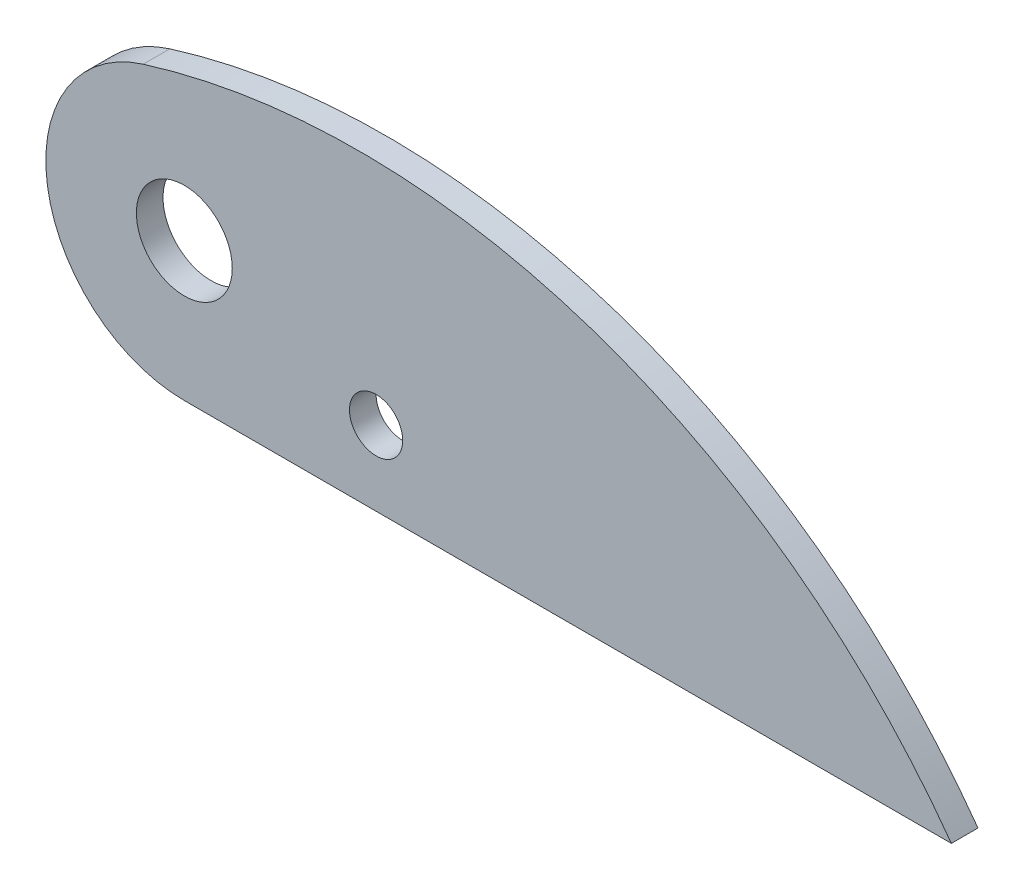
ISO-10303-21;
HEADER;
FILE_DESCRIPTION(('STEP AP214'),'2;1');
FILE_NAME('part.step','',(''),(''),'','','');
FILE_SCHEMA(('AUTOMOTIVE_DESIGN { 1 0 10303 214 1 1 1 1 }'));
ENDSEC;
DATA;
#1=APPLICATION_CONTEXT('core data for automotive mechanical design processes');
#2=APPLICATION_PROTOCOL_DEFINITION('international standard','automotive_design',2000,#1);
#3=PRODUCT_CONTEXT('',#1,'mechanical');
#4=PRODUCT('Part','Part','',(#3));
#5=PRODUCT_RELATED_PRODUCT_CATEGORY('part','',(#4));
#6=PRODUCT_DEFINITION_FORMATION('','',#4);
#7=PRODUCT_DEFINITION_CONTEXT('part definition',#1,'design');
#8=PRODUCT_DEFINITION('design','',#6,#7);
#9=PRODUCT_DEFINITION_SHAPE('','',#8);
#10=(LENGTH_UNIT() NAMED_UNIT(*) SI_UNIT(.MILLI.,.METRE.));
#11=(NAMED_UNIT(*) PLANE_ANGLE_UNIT() SI_UNIT($,.RADIAN.));
#12=(NAMED_UNIT(*) SI_UNIT($,.STERADIAN.) SOLID_ANGLE_UNIT());
#13=UNCERTAINTY_MEASURE_WITH_UNIT(LENGTH_MEASURE(1.E-05),#10,'distance_accuracy_value','');
#14=(GEOMETRIC_REPRESENTATION_CONTEXT(3) GLOBAL_UNCERTAINTY_ASSIGNED_CONTEXT((#13)) GLOBAL_UNIT_ASSIGNED_CONTEXT((#10,
#11,#12)) REPRESENTATION_CONTEXT('',''));
#15=CARTESIAN_POINT('',(0.,0.,0.));
#16=DIRECTION('',(0.,0.,1.));
#17=DIRECTION('',(1.,0.,0.));
#18=AXIS2_PLACEMENT_3D('',#15,#16,#17);
#19=CARTESIAN_POINT('',(0.,0.,2.5));
#20=DIRECTION('',(0.,0.,-1.));
#21=DIRECTION('',(-1.,0.,0.));
#22=AXIS2_PLACEMENT_3D('',#19,#20,#21);
#23=PLANE('',#22);
#24=CARTESIAN_POINT('',(0.,0.,2.5));
#25=DIRECTION('',(0.,0.,1.));
#26=DIRECTION('',(-1.,0.,0.));
#27=AXIS2_PLACEMENT_3D('',#24,#25,#26);
#28=CIRCLE('',#27,13.);
#29=CARTESIAN_POINT('',(-3.8556101254067,12.4150823823631,2.5));
#30=VERTEX_POINT('',#29);
#31=CARTESIAN_POINT('',(0.,-13.,2.5));
#32=VERTEX_POINT('',#31);
#33=EDGE_CURVE('E80',#30,#32,#28,.T.);
#34=ORIENTED_EDGE('',*,*,#33,.T.);
#35=DIRECTION('',(1.,0.,0.));
#36=VECTOR('',#35,1.);
#37=CARTESIAN_POINT('',(0.,-13.,2.5));
#38=LINE('',#37,#36);
#39=CARTESIAN_POINT('',(72.,-13.,2.5));
#40=VERTEX_POINT('',#39);
#41=EDGE_CURVE('E76',#32,#40,#38,.T.);
#42=ORIENTED_EDGE('',*,*,#41,.T.);
#43=CARTESIAN_POINT('',(16.4370747451547,-52.9274564721794,2.5));
#44=DIRECTION('',(0.,0.,1.));
#45=DIRECTION('',(-1.,0.,0.));
#46=AXIS2_PLACEMENT_3D('',#43,#44,#45);
#47=CIRCLE('',#46,68.421052631579);
#48=EDGE_CURVE('E56',#40,#30,#47,.T.);
#49=ORIENTED_EDGE('',*,*,#48,.T.);
#50=EDGE_LOOP('',(#34,#42,#49));
#51=FACE_BOUND('',#50,.T.);
#52=CARTESIAN_POINT('',(0.,0.,2.5));
#53=DIRECTION('',(0.,0.,1.));
#54=DIRECTION('',(1.,0.,0.));
#55=AXIS2_PLACEMENT_3D('',#52,#53,#54);
#56=CIRCLE('',#55,4.50000000000025);
#57=CARTESIAN_POINT('',(4.50000000000025,0.,2.5));
#58=VERTEX_POINT('',#57);
#59=EDGE_CURVE('E90',#58,#58,#56,.T.);
#60=ORIENTED_EDGE('',*,*,#59,.F.);
#61=EDGE_LOOP('',(#60));
#62=FACE_BOUND('',#61,.T.);
#63=CARTESIAN_POINT('',(18.,-6.,2.5));
#64=DIRECTION('',(0.,0.,1.));
#65=DIRECTION('',(1.,0.,0.));
#66=AXIS2_PLACEMENT_3D('',#63,#64,#65);
#67=CIRCLE('',#66,2.50000000000012);
#68=CARTESIAN_POINT('',(20.5000000000001,-6.,2.5));
#69=VERTEX_POINT('',#68);
#70=EDGE_CURVE('E109',#69,#69,#67,.T.);
#71=ORIENTED_EDGE('',*,*,#70,.F.);
#72=EDGE_LOOP('',(#71));
#73=FACE_BOUND('',#72,.T.);
#74=ADVANCED_FACE('F39',(#51,#62,#73),#23,.F.);
#75=CARTESIAN_POINT('',(0.,0.,0.));
#76=DIRECTION('',(0.,0.,-1.));
#77=DIRECTION('',(-1.,0.,0.));
#78=AXIS2_PLACEMENT_3D('',#75,#76,#77);
#79=PLANE('',#78);
#80=CARTESIAN_POINT('',(0.,0.,0.));
#81=DIRECTION('',(0.,0.,1.));
#82=DIRECTION('',(1.,0.,0.));
#83=AXIS2_PLACEMENT_3D('',#80,#81,#82);
#84=CIRCLE('',#83,4.50000000000025);
#85=CARTESIAN_POINT('',(4.50000000000025,0.,0.));
#86=VERTEX_POINT('',#85);
#87=EDGE_CURVE('E94',#86,#86,#84,.T.);
#88=ORIENTED_EDGE('',*,*,#87,.T.);
#89=EDGE_LOOP('',(#88));
#90=FACE_BOUND('',#89,.T.);
#91=CARTESIAN_POINT('',(0.,0.,0.));
#92=DIRECTION('',(0.,0.,1.));
#93=DIRECTION('',(-1.,0.,0.));
#94=AXIS2_PLACEMENT_3D('',#91,#92,#93);
#95=CIRCLE('',#94,13.);
#96=CARTESIAN_POINT('',(-3.8556101254067,12.4150823823631,0.));
#97=VERTEX_POINT('',#96);
#98=CARTESIAN_POINT('',(0.,-13.,0.));
#99=VERTEX_POINT('',#98);
#100=EDGE_CURVE('E87',#97,#99,#95,.T.);
#101=ORIENTED_EDGE('',*,*,#100,.F.);
#102=CARTESIAN_POINT('',(16.4370747451547,-52.9274564721794,0.));
#103=DIRECTION('',(0.,0.,1.));
#104=DIRECTION('',(-1.,0.,0.));
#105=AXIS2_PLACEMENT_3D('',#102,#103,#104);
#106=CIRCLE('',#105,68.421052631579);
#107=CARTESIAN_POINT('',(72.,-13.,0.));
#108=VERTEX_POINT('',#107);
#109=EDGE_CURVE('E73',#108,#97,#106,.T.);
#110=ORIENTED_EDGE('',*,*,#109,.F.);
#111=DIRECTION('',(1.,0.,0.));
#112=VECTOR('',#111,1.);
#113=CARTESIAN_POINT('',(0.,-13.,0.));
#114=LINE('',#113,#112);
#115=EDGE_CURVE('E68',#99,#108,#114,.T.);
#116=ORIENTED_EDGE('',*,*,#115,.F.);
#117=EDGE_LOOP('',(#101,#110,#116));
#118=FACE_BOUND('',#117,.T.);
#119=CARTESIAN_POINT('',(18.,-6.,0.));
#120=DIRECTION('',(0.,0.,1.));
#121=DIRECTION('',(1.,0.,0.));
#122=AXIS2_PLACEMENT_3D('',#119,#120,#121);
#123=CIRCLE('',#122,2.50000000000012);
#124=CARTESIAN_POINT('',(20.5000000000001,-6.,0.));
#125=VERTEX_POINT('',#124);
#126=EDGE_CURVE('E107',#125,#125,#123,.T.);
#127=ORIENTED_EDGE('',*,*,#126,.T.);
#128=EDGE_LOOP('',(#127));
#129=FACE_BOUND('',#128,.T.);
#130=ADVANCED_FACE('F100',(#90,#118,#129),#79,.T.);
#131=CARTESIAN_POINT('',(0.,0.,2.5));
#132=DIRECTION('',(0.,0.,-1.));
#133=DIRECTION('',(-1.,0.,0.));
#134=AXIS2_PLACEMENT_3D('',#131,#132,#133);
#135=CYLINDRICAL_SURFACE('',#134,13.);
#136=ORIENTED_EDGE('',*,*,#100,.T.);
#137=DIRECTION('',(0.,0.,-1.));
#138=VECTOR('',#137,1.);
#139=CARTESIAN_POINT('',(0.,-13.,2.5));
#140=LINE('',#139,#138);
#141=EDGE_CURVE('E11',#32,#99,#140,.T.);
#142=ORIENTED_EDGE('',*,*,#141,.F.);
#143=ORIENTED_EDGE('',*,*,#33,.F.);
#144=DIRECTION('',(0.,0.,-1.));
#145=VECTOR('',#144,1.);
#146=CARTESIAN_POINT('',(-3.8556101254067,12.4150823823631,2.5));
#147=LINE('',#146,#145);
#148=EDGE_CURVE('E88',#30,#97,#147,.T.);
#149=ORIENTED_EDGE('',*,*,#148,.T.);
#150=EDGE_LOOP('',(#136,#142,#143,#149));
#151=FACE_BOUND('',#150,.T.);
#152=ADVANCED_FACE('F41',(#151),#135,.T.);
#153=CARTESIAN_POINT('',(0.,-13.,2.5));
#154=DIRECTION('',(0.,1.,0.));
#155=DIRECTION('',(0.,0.,1.));
#156=AXIS2_PLACEMENT_3D('',#153,#154,#155);
#157=PLANE('',#156);
#158=ORIENTED_EDGE('',*,*,#115,.T.);
#159=DIRECTION('',(0.,0.,-1.));
#160=VECTOR('',#159,1.);
#161=CARTESIAN_POINT('',(72.,-13.,2.5));
#162=LINE('',#161,#160);
#163=EDGE_CURVE('E48',#40,#108,#162,.T.);
#164=ORIENTED_EDGE('',*,*,#163,.F.);
#165=ORIENTED_EDGE('',*,*,#41,.F.);
#166=ORIENTED_EDGE('',*,*,#141,.T.);
#167=EDGE_LOOP('',(#158,#164,#165,#166));
#168=FACE_BOUND('',#167,.T.);
#169=ADVANCED_FACE('F77',(#168),#157,.F.);
#170=CARTESIAN_POINT('',(16.4370747451547,-52.9274564721794,2.5));
#171=DIRECTION('',(0.,0.,-1.));
#172=DIRECTION('',(-1.,0.,0.));
#173=AXIS2_PLACEMENT_3D('',#170,#171,#172);
#174=CYLINDRICAL_SURFACE('',#173,68.421052631579);
#175=ORIENTED_EDGE('',*,*,#109,.T.);
#176=ORIENTED_EDGE('',*,*,#148,.F.);
#177=ORIENTED_EDGE('',*,*,#48,.F.);
#178=ORIENTED_EDGE('',*,*,#163,.T.);
#179=EDGE_LOOP('',(#175,#176,#177,#178));
#180=FACE_BOUND('',#179,.T.);
#181=ADVANCED_FACE('F99',(#180),#174,.T.);
#182=CARTESIAN_POINT('',(0.,0.,2.5));
#183=DIRECTION('',(0.,0.,-1.));
#184=DIRECTION('',(-1.,0.,0.));
#185=AXIS2_PLACEMENT_3D('',#182,#183,#184);
#186=CYLINDRICAL_SURFACE('',#185,4.50000000000025);
#187=ORIENTED_EDGE('',*,*,#59,.T.);
#188=EDGE_LOOP('',(#187));
#189=FACE_BOUND('',#188,.T.);
#190=ORIENTED_EDGE('',*,*,#87,.F.);
#191=EDGE_LOOP('',(#190));
#192=FACE_BOUND('',#191,.T.);
#193=ADVANCED_FACE('F117',(#189,#192),#186,.F.);
#194=CARTESIAN_POINT('',(18.,-6.,2.5));
#195=DIRECTION('',(0.,0.,-1.));
#196=DIRECTION('',(-1.,0.,0.));
#197=AXIS2_PLACEMENT_3D('',#194,#195,#196);
#198=CYLINDRICAL_SURFACE('',#197,2.50000000000012);
#199=ORIENTED_EDGE('',*,*,#70,.T.);
#200=EDGE_LOOP('',(#199));
#201=FACE_BOUND('',#200,.T.);
#202=ORIENTED_EDGE('',*,*,#126,.F.);
#203=EDGE_LOOP('',(#202));
#204=FACE_BOUND('',#203,.T.);
#205=ADVANCED_FACE('F119',(#201,#204),#198,.F.);
#206=CLOSED_SHELL('',(#74,#130,#152,#169,#181,#193,#205));
#207=MANIFOLD_SOLID_BREP('B2',#206);
#208=ADVANCED_BREP_SHAPE_REPRESENTATION('',(#18,#207),#14);
#209=SHAPE_DEFINITION_REPRESENTATION(#9,#208);
ENDSEC;
END-ISO-10303-21;
